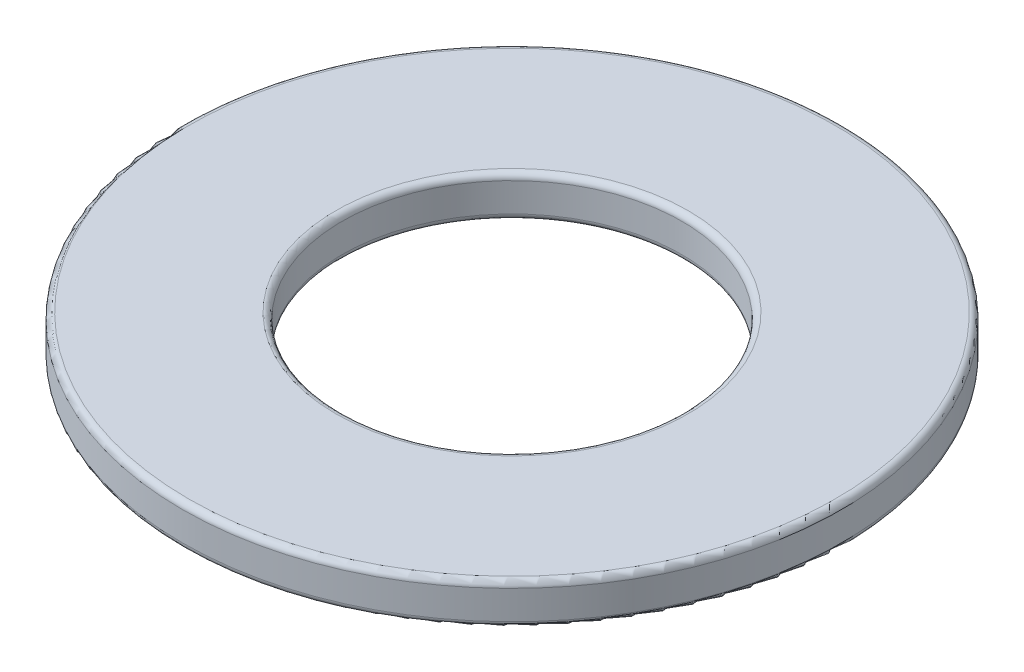
ISO-10303-21;
HEADER;
FILE_DESCRIPTION(('STEP AP214'),'2;1');
FILE_NAME('part.step','',(''),(''),'','','');
FILE_SCHEMA(('AUTOMOTIVE_DESIGN { 1 0 10303 214 1 1 1 1 }'));
ENDSEC;
DATA;
#1=APPLICATION_CONTEXT('core data for automotive mechanical design processes');
#2=APPLICATION_PROTOCOL_DEFINITION('international standard','automotive_design',2000,#1);
#3=PRODUCT_CONTEXT('',#1,'mechanical');
#4=PRODUCT('Part','Part','',(#3));
#5=PRODUCT_RELATED_PRODUCT_CATEGORY('part','',(#4));
#6=PRODUCT_DEFINITION_FORMATION('','',#4);
#7=PRODUCT_DEFINITION_CONTEXT('part definition',#1,'design');
#8=PRODUCT_DEFINITION('design','',#6,#7);
#9=PRODUCT_DEFINITION_SHAPE('','',#8);
#10=(LENGTH_UNIT() NAMED_UNIT(*) SI_UNIT(.MILLI.,.METRE.));
#11=(NAMED_UNIT(*) PLANE_ANGLE_UNIT() SI_UNIT($,.RADIAN.));
#12=(NAMED_UNIT(*) SI_UNIT($,.STERADIAN.) SOLID_ANGLE_UNIT());
#13=UNCERTAINTY_MEASURE_WITH_UNIT(LENGTH_MEASURE(1.E-05),#10,'distance_accuracy_value','');
#14=(GEOMETRIC_REPRESENTATION_CONTEXT(3) GLOBAL_UNCERTAINTY_ASSIGNED_CONTEXT((#13)) GLOBAL_UNIT_ASSIGNED_CONTEXT((#10,
#11,#12)) REPRESENTATION_CONTEXT('',''));
#15=CARTESIAN_POINT('',(0.,0.,0.));
#16=DIRECTION('',(0.,0.,1.));
#17=DIRECTION('',(1.,0.,0.));
#18=AXIS2_PLACEMENT_3D('',#15,#16,#17);
#19=CARTESIAN_POINT('',(0.,0.5,0.));
#20=DIRECTION('',(0.,1.,0.));
#21=DIRECTION('',(0.,0.,1.));
#22=AXIS2_PLACEMENT_3D('',#19,#20,#21);
#23=PLANE('',#22);
#24=CARTESIAN_POINT('',(0.,0.5,0.));
#25=DIRECTION('',(0.,1.,0.));
#26=DIRECTION('',(0.,0.,1.));
#27=AXIS2_PLACEMENT_3D('',#24,#25,#26);
#28=CIRCLE('',#27,4.275);
#29=CARTESIAN_POINT('',(0.,0.5,4.275));
#30=VERTEX_POINT('',#29);
#31=EDGE_CURVE('E48',#30,#30,#28,.F.);
#32=ORIENTED_EDGE('',*,*,#31,.T.);
#33=EDGE_LOOP('',(#32));
#34=FACE_BOUND('',#33,.T.);
#35=CARTESIAN_POINT('',(0.,0.5,0.));
#36=DIRECTION('',(0.,1.,0.));
#37=DIRECTION('',(0.,0.,1.));
#38=AXIS2_PLACEMENT_3D('',#35,#36,#37);
#39=CIRCLE('',#38,7.85);
#40=CARTESIAN_POINT('',(0.,0.5,7.85));
#41=VERTEX_POINT('',#40);
#42=EDGE_CURVE('E52',#41,#41,#39,.T.);
#43=ORIENTED_EDGE('',*,*,#42,.T.);
#44=EDGE_LOOP('',(#43));
#45=FACE_BOUND('',#44,.T.);
#46=ADVANCED_FACE('F37',(#34,#45),#23,.T.);
#47=CARTESIAN_POINT('',(0.,-0.5,0.));
#48=DIRECTION('',(0.,1.,0.));
#49=DIRECTION('',(0.,0.,1.));
#50=AXIS2_PLACEMENT_3D('',#47,#48,#49);
#51=PLANE('',#50);
#52=CARTESIAN_POINT('',(0.,-0.5,0.));
#53=DIRECTION('',(0.,1.,0.));
#54=DIRECTION('',(0.,0.,1.));
#55=AXIS2_PLACEMENT_3D('',#52,#53,#54);
#56=CIRCLE('',#55,4.275);
#57=CARTESIAN_POINT('',(0.,-0.5,4.275));
#58=VERTEX_POINT('',#57);
#59=EDGE_CURVE('E63',#58,#58,#56,.T.);
#60=ORIENTED_EDGE('',*,*,#59,.T.);
#61=EDGE_LOOP('',(#60));
#62=FACE_BOUND('',#61,.T.);
#63=CARTESIAN_POINT('',(0.,-0.5,0.));
#64=DIRECTION('',(0.,1.,0.));
#65=DIRECTION('',(0.,0.,1.));
#66=AXIS2_PLACEMENT_3D('',#63,#64,#65);
#67=CIRCLE('',#66,7.85);
#68=CARTESIAN_POINT('',(0.,-0.5,7.85));
#69=VERTEX_POINT('',#68);
#70=EDGE_CURVE('E66',#69,#69,#67,.F.);
#71=ORIENTED_EDGE('',*,*,#70,.T.);
#72=EDGE_LOOP('',(#71));
#73=FACE_BOUND('',#72,.T.);
#74=ADVANCED_FACE('F70',(#62,#73),#51,.F.);
#75=CARTESIAN_POINT('',(0.,0.5,0.));
#76=DIRECTION('',(0.,-1.,0.));
#77=DIRECTION('',(0.,0.,-1.));
#78=AXIS2_PLACEMENT_3D('',#75,#76,#77);
#79=CYLINDRICAL_SURFACE('',#78,8.);
#80=CARTESIAN_POINT('',(0.,-0.35,0.));
#81=DIRECTION('',(0.,1.,0.));
#82=DIRECTION('',(0.,0.,1.));
#83=AXIS2_PLACEMENT_3D('',#80,#81,#82);
#84=CIRCLE('',#83,8.);
#85=CARTESIAN_POINT('',(0.,-0.35,8.));
#86=VERTEX_POINT('',#85);
#87=EDGE_CURVE('E10',#86,#86,#84,.T.);
#88=ORIENTED_EDGE('',*,*,#87,.T.);
#89=EDGE_LOOP('',(#88));
#90=FACE_BOUND('',#89,.T.);
#91=CARTESIAN_POINT('',(0.,0.35,0.));
#92=DIRECTION('',(0.,1.,0.));
#93=DIRECTION('',(0.,0.,1.));
#94=AXIS2_PLACEMENT_3D('',#91,#92,#93);
#95=CIRCLE('',#94,8.);
#96=CARTESIAN_POINT('',(0.,0.35,8.));
#97=VERTEX_POINT('',#96);
#98=EDGE_CURVE('E44',#97,#97,#95,.F.);
#99=ORIENTED_EDGE('',*,*,#98,.T.);
#100=EDGE_LOOP('',(#99));
#101=FACE_BOUND('',#100,.T.);
#102=ADVANCED_FACE('F90',(#90,#101),#79,.T.);
#103=CARTESIAN_POINT('',(0.,0.5,0.));
#104=DIRECTION('',(0.,-1.,0.));
#105=DIRECTION('',(0.,0.,-1.));
#106=AXIS2_PLACEMENT_3D('',#103,#104,#105);
#107=CYLINDRICAL_SURFACE('',#106,4.125);
#108=CARTESIAN_POINT('',(0.,-0.35,0.));
#109=DIRECTION('',(0.,1.,0.));
#110=DIRECTION('',(0.,0.,1.));
#111=AXIS2_PLACEMENT_3D('',#108,#109,#110);
#112=CIRCLE('',#111,4.125);
#113=CARTESIAN_POINT('',(0.,-0.35,4.125));
#114=VERTEX_POINT('',#113);
#115=EDGE_CURVE('E57',#114,#114,#112,.F.);
#116=ORIENTED_EDGE('',*,*,#115,.T.);
#117=EDGE_LOOP('',(#116));
#118=FACE_BOUND('',#117,.T.);
#119=CARTESIAN_POINT('',(0.,0.35,0.));
#120=DIRECTION('',(0.,1.,0.));
#121=DIRECTION('',(0.,0.,1.));
#122=AXIS2_PLACEMENT_3D('',#119,#120,#121);
#123=CIRCLE('',#122,4.125);
#124=CARTESIAN_POINT('',(0.,0.35,4.125));
#125=VERTEX_POINT('',#124);
#126=EDGE_CURVE('E60',#125,#125,#123,.T.);
#127=ORIENTED_EDGE('',*,*,#126,.T.);
#128=EDGE_LOOP('',(#127));
#129=FACE_BOUND('',#128,.T.);
#130=ADVANCED_FACE('F95',(#118,#129),#107,.F.);
#131=CARTESIAN_POINT('',(0.,-0.35,0.));
#132=DIRECTION('',(0.,1.,0.));
#133=DIRECTION('',(0.,0.,1.));
#134=AXIS2_PLACEMENT_3D('',#131,#132,#133);
#135=TOROIDAL_SURFACE('',#134,4.275,0.15);
#136=ORIENTED_EDGE('',*,*,#115,.F.);
#137=EDGE_LOOP('',(#136));
#138=FACE_BOUND('',#137,.T.);
#139=ORIENTED_EDGE('',*,*,#59,.F.);
#140=EDGE_LOOP('',(#139));
#141=FACE_BOUND('',#140,.T.);
#142=ADVANCED_FACE('F81',(#138,#141),#135,.T.);
#143=CARTESIAN_POINT('',(0.,0.35,0.));
#144=DIRECTION('',(0.,1.,0.));
#145=DIRECTION('',(0.,0.,1.));
#146=AXIS2_PLACEMENT_3D('',#143,#144,#145);
#147=TOROIDAL_SURFACE('',#146,4.275,0.15);
#148=ORIENTED_EDGE('',*,*,#31,.F.);
#149=EDGE_LOOP('',(#148));
#150=FACE_BOUND('',#149,.T.);
#151=ORIENTED_EDGE('',*,*,#126,.F.);
#152=EDGE_LOOP('',(#151));
#153=FACE_BOUND('',#152,.T.);
#154=ADVANCED_FACE('F75',(#150,#153),#147,.T.);
#155=CARTESIAN_POINT('',(0.,-0.35,0.));
#156=DIRECTION('',(0.,1.,0.));
#157=DIRECTION('',(0.,0.,1.));
#158=AXIS2_PLACEMENT_3D('',#155,#156,#157);
#159=TOROIDAL_SURFACE('',#158,7.85,0.15);
#160=ORIENTED_EDGE('',*,*,#70,.F.);
#161=EDGE_LOOP('',(#160));
#162=FACE_BOUND('',#161,.T.);
#163=ORIENTED_EDGE('',*,*,#87,.F.);
#164=EDGE_LOOP('',(#163));
#165=FACE_BOUND('',#164,.T.);
#166=ADVANCED_FACE('F72',(#162,#165),#159,.T.);
#167=CARTESIAN_POINT('',(0.,0.35,0.));
#168=DIRECTION('',(0.,1.,0.));
#169=DIRECTION('',(0.,0.,1.));
#170=AXIS2_PLACEMENT_3D('',#167,#168,#169);
#171=TOROIDAL_SURFACE('',#170,7.85,0.15);
#172=ORIENTED_EDGE('',*,*,#98,.F.);
#173=EDGE_LOOP('',(#172));
#174=FACE_BOUND('',#173,.T.);
#175=ORIENTED_EDGE('',*,*,#42,.F.);
#176=EDGE_LOOP('',(#175));
#177=FACE_BOUND('',#176,.T.);
#178=ADVANCED_FACE('F39',(#174,#177),#171,.T.);
#179=CLOSED_SHELL('',(#46,#74,#102,#130,#142,#154,#166,#178));
#180=MANIFOLD_SOLID_BREP('B2',#179);
#181=ADVANCED_BREP_SHAPE_REPRESENTATION('',(#18,#180),#14);
#182=SHAPE_DEFINITION_REPRESENTATION(#9,#181);
ENDSEC;
END-ISO-10303-21;
